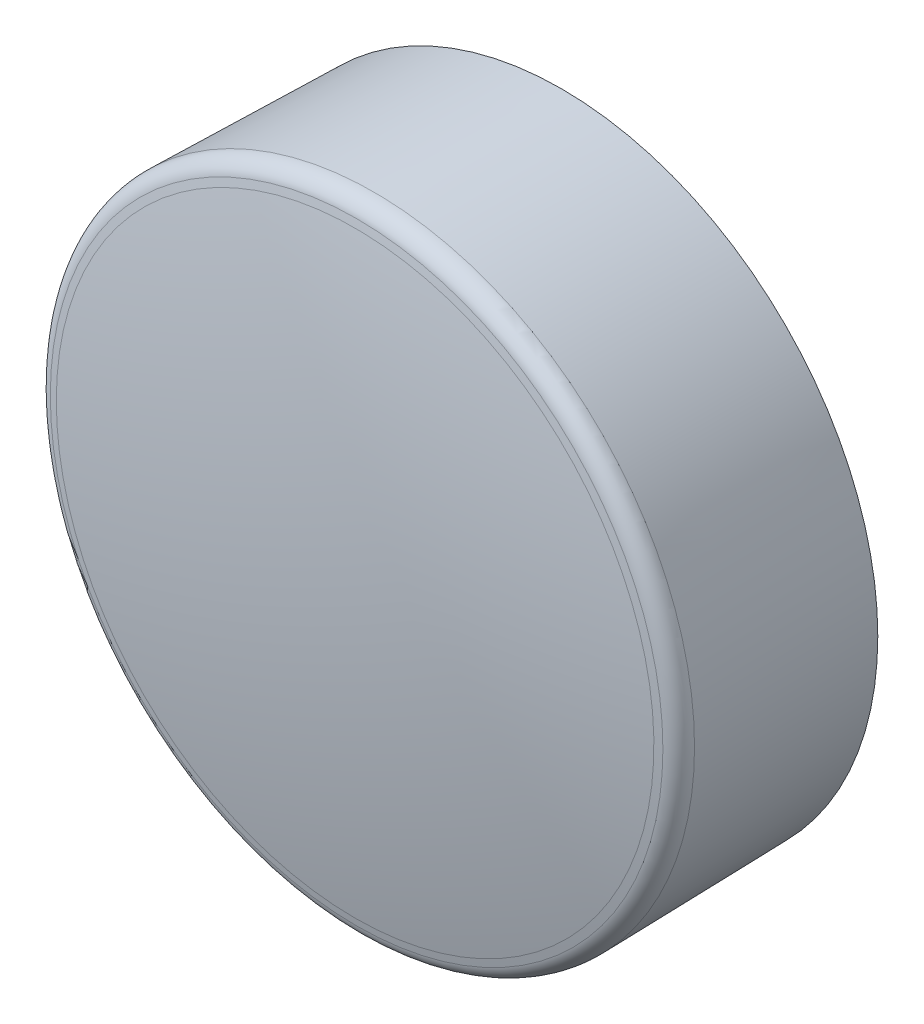
ISO-10303-21;
HEADER;
FILE_DESCRIPTION(('STEP AP214'),'2;1');
FILE_NAME('part.step','',(''),(''),'','','');
FILE_SCHEMA(('AUTOMOTIVE_DESIGN { 1 0 10303 214 1 1 1 1 }'));
ENDSEC;
DATA;
#1=APPLICATION_CONTEXT('core data for automotive mechanical design processes');
#2=APPLICATION_PROTOCOL_DEFINITION('international standard','automotive_design',2000,#1);
#3=PRODUCT_CONTEXT('',#1,'mechanical');
#4=PRODUCT('Part','Part','',(#3));
#5=PRODUCT_RELATED_PRODUCT_CATEGORY('part','',(#4));
#6=PRODUCT_DEFINITION_FORMATION('','',#4);
#7=PRODUCT_DEFINITION_CONTEXT('part definition',#1,'design');
#8=PRODUCT_DEFINITION('design','',#6,#7);
#9=PRODUCT_DEFINITION_SHAPE('','',#8);
#10=(LENGTH_UNIT() NAMED_UNIT(*) SI_UNIT(.MILLI.,.METRE.));
#11=(NAMED_UNIT(*) PLANE_ANGLE_UNIT() SI_UNIT($,.RADIAN.));
#12=(NAMED_UNIT(*) SI_UNIT($,.STERADIAN.) SOLID_ANGLE_UNIT());
#13=UNCERTAINTY_MEASURE_WITH_UNIT(LENGTH_MEASURE(1.E-05),#10,'distance_accuracy_value','');
#14=(GEOMETRIC_REPRESENTATION_CONTEXT(3) GLOBAL_UNCERTAINTY_ASSIGNED_CONTEXT((#13)) GLOBAL_UNIT_ASSIGNED_CONTEXT((#10,
#11,#12)) REPRESENTATION_CONTEXT('',''));
#15=CARTESIAN_POINT('',(0.,0.,0.));
#16=DIRECTION('',(0.,0.,1.));
#17=DIRECTION('',(1.,0.,0.));
#18=AXIS2_PLACEMENT_3D('',#15,#16,#17);
#19=CARTESIAN_POINT('',(0.,0.,6.00000008940697));
#20=DIRECTION('',(0.,0.,1.));
#21=DIRECTION('',(1.,0.,0.));
#22=AXIS2_PLACEMENT_3D('',#19,#20,#21);
#23=SPHERICAL_SURFACE('',#22,2.17741141713995);
#24=CARTESIAN_POINT('',(0.,0.,7.63632094803309));
#25=DIRECTION('',(0.,0.,-1.));
#26=DIRECTION('',(1.,0.,0.));
#27=AXIS2_PLACEMENT_3D('',#24,#25,#26);
#28=CIRCLE('',#27,1.43651471524536);
#29=CARTESIAN_POINT('',(-1.43651471524536,0.,7.63632094803309));
#30=VERTEX_POINT('',#29);
#31=CARTESIAN_POINT('',(0.,-1.43651471524536,7.63632094803309));
#32=VERTEX_POINT('',#31);
#33=EDGE_CURVE('P0_E19',#30,#32,#28,.T.);
#34=ORIENTED_EDGE('',*,*,#33,.F.);
#35=CARTESIAN_POINT('',(0.,0.,6.00000008940697));
#36=DIRECTION('',(0.,-1.,0.));
#37=DIRECTION('',(-1.,0.,0.));
#38=AXIS2_PLACEMENT_3D('',#35,#36,#37);
#39=CIRCLE('',#38,2.17741141713995);
#40=CARTESIAN_POINT('',(0.,0.,8.17741150654691));
#41=VERTEX_POINT('',#40);
#42=EDGE_CURVE('P0_E11',#41,#30,#39,.T.);
#43=ORIENTED_EDGE('',*,*,#42,.F.);
#44=ORIENTED_EDGE('',*,*,#42,.T.);
#45=CARTESIAN_POINT('',(0.,0.,7.63632094803309));
#46=DIRECTION('',(0.,0.,-1.));
#47=DIRECTION('',(1.,0.,0.));
#48=AXIS2_PLACEMENT_3D('',#45,#46,#47);
#49=CIRCLE('',#48,1.43651471524536);
#50=EDGE_CURVE('P0_E56',#32,#30,#49,.T.);
#51=ORIENTED_EDGE('',*,*,#50,.F.);
#52=EDGE_LOOP('',(#34,#43,#44,#51));
#53=FACE_BOUND('',#52,.T.);
#54=ADVANCED_FACE('P0_F16',(#53),#23,.T.);
#55=CARTESIAN_POINT('',(0.,0.,6.00000008940697));
#56=DIRECTION('',(0.,0.,-1.));
#57=DIRECTION('',(0.,-1.,0.));
#58=AXIS2_PLACEMENT_3D('',#55,#56,#57);
#59=PLANE('',#58);
#60=CARTESIAN_POINT('',(0.,0.,6.00000008940697));
#61=DIRECTION('',(0.,0.,-1.));
#62=DIRECTION('',(1.,0.,0.));
#63=AXIS2_PLACEMENT_3D('',#60,#61,#62);
#64=CIRCLE('',#63,1.43651471524536);
#65=CARTESIAN_POINT('',(0.,-1.43651471524536,6.00000008940697));
#66=VERTEX_POINT('',#65);
#67=EDGE_CURVE('P0_E53',#66,#66,#64,.T.);
#68=ORIENTED_EDGE('',*,*,#67,.T.);
#69=EDGE_LOOP('',(#68));
#70=FACE_BOUND('',#69,.T.);
#71=ADVANCED_FACE('P0_F58',(#70),#59,.T.);
#72=CARTESIAN_POINT('',(0.,0.,6.81816051872003));
#73=DIRECTION('',(0.,0.,-1.));
#74=DIRECTION('',(0.,1.,0.));
#75=AXIS2_PLACEMENT_3D('',#72,#73,#74);
#76=CYLINDRICAL_SURFACE('',#75,1.43651471524536);
#77=ORIENTED_EDGE('',*,*,#67,.F.);
#78=DIRECTION('',(0.,0.,1.));
#79=VECTOR('',#78,1.);
#80=CARTESIAN_POINT('',(0.,-1.43651471524536,6.81816051872003));
#81=LINE('',#80,#79);
#82=EDGE_CURVE('P0_E50',#66,#32,#81,.T.);
#83=ORIENTED_EDGE('',*,*,#82,.T.);
#84=ORIENTED_EDGE('',*,*,#50,.T.);
#85=ORIENTED_EDGE('',*,*,#33,.T.);
#86=ORIENTED_EDGE('',*,*,#82,.F.);
#87=EDGE_LOOP('',(#77,#83,#84,#85,#86));
#88=FACE_BOUND('',#87,.T.);
#89=ADVANCED_FACE('P0_F52',(#88),#76,.T.);
#90=CLOSED_SHELL('',(#54,#71,#89));
#91=MANIFOLD_SOLID_BREP('P0_B1',#90);
#92=CARTESIAN_POINT('',(0.,0.,8.78711953919315));
#93=DIRECTION('',(0.,0.,1.));
#94=DIRECTION('',(0.,1.,0.));
#95=AXIS2_PLACEMENT_3D('',#92,#93,#94);
#96=CONICAL_SURFACE('',#95,4.11323306509245,1.1647582702333);
#97=CARTESIAN_POINT('',(0.,0.,7.63632094803309));
#98=DIRECTION('',(0.,0.,-1.));
#99=DIRECTION('',(1.,0.,0.));
#100=AXIS2_PLACEMENT_3D('',#97,#98,#99);
#101=CIRCLE('',#100,1.43651471524536);
#102=CARTESIAN_POINT('',(0.,-1.43651471524536,7.63632094803309));
#103=VERTEX_POINT('',#102);
#104=EDGE_CURVE('P1_E25',#103,#103,#101,.T.);
#105=ORIENTED_EDGE('',*,*,#104,.T.);
#106=DIRECTION('',(0.,-0.918692888285036,0.394972628183901));
#107=VECTOR('',#106,1.);
#108=CARTESIAN_POINT('',(0.,-4.11323306509245,8.78711953919315));
#109=LINE('',#108,#107);
#110=CARTESIAN_POINT('',(0.,-6.78995141493954,9.9379181303532));
#111=VERTEX_POINT('',#110);
#112=EDGE_CURVE('P1_E11',#103,#111,#109,.T.);
#113=ORIENTED_EDGE('',*,*,#112,.T.);
#114=CARTESIAN_POINT('',(0.,0.,9.9379181303532));
#115=DIRECTION('',(0.,0.,-1.));
#116=DIRECTION('',(1.,0.,0.));
#117=AXIS2_PLACEMENT_3D('',#114,#115,#116);
#118=CIRCLE('',#117,6.78995141493954);
#119=EDGE_CURVE('P1_E52',#111,#111,#118,.T.);
#120=ORIENTED_EDGE('',*,*,#119,.F.);
#121=ORIENTED_EDGE('',*,*,#112,.F.);
#122=EDGE_LOOP('',(#105,#113,#120,#121));
#123=FACE_BOUND('',#122,.T.);
#124=ADVANCED_FACE('P1_F16',(#123),#96,.F.);
#125=CARTESIAN_POINT('',(0.,0.,6.81816051872003));
#126=DIRECTION('',(0.,0.,-1.));
#127=DIRECTION('',(0.,1.,0.));
#128=AXIS2_PLACEMENT_3D('',#125,#126,#127);
#129=CYLINDRICAL_SURFACE('',#128,1.43651471524536);
#130=CARTESIAN_POINT('',(0.,0.,6.00000008940697));
#131=DIRECTION('',(0.,0.,-1.));
#132=DIRECTION('',(1.,0.,0.));
#133=AXIS2_PLACEMENT_3D('',#130,#131,#132);
#134=CIRCLE('',#133,1.43651471524536);
#135=CARTESIAN_POINT('',(0.,-1.43651471524536,6.00000008940697));
#136=VERTEX_POINT('',#135);
#137=EDGE_CURVE('P1_E65',#136,#136,#134,.T.);
#138=ORIENTED_EDGE('',*,*,#137,.T.);
#139=DIRECTION('',(0.,0.,1.));
#140=VECTOR('',#139,1.);
#141=CARTESIAN_POINT('',(0.,-1.43651471524536,6.81816051872003));
#142=LINE('',#141,#140);
#143=EDGE_CURVE('P1_E69',#136,#103,#142,.T.);
#144=ORIENTED_EDGE('',*,*,#143,.T.);
#145=ORIENTED_EDGE('',*,*,#104,.F.);
#146=ORIENTED_EDGE('',*,*,#143,.F.);
#147=EDGE_LOOP('',(#138,#144,#145,#146));
#148=FACE_BOUND('',#147,.T.);
#149=ADVANCED_FACE('P1_F77',(#148),#129,.F.);
#150=CARTESIAN_POINT('',(0.,1.43651471524536,6.00000008940697));
#151=DIRECTION('',(0.,0.,-1.));
#152=DIRECTION('',(0.,-1.,0.));
#153=AXIS2_PLACEMENT_3D('',#150,#151,#152);
#154=PLANE('',#153);
#155=ORIENTED_EDGE('',*,*,#137,.F.);
#156=EDGE_LOOP('',(#155));
#157=FACE_BOUND('',#156,.T.);
#158=CARTESIAN_POINT('',(0.,0.,6.00000008940697));
#159=DIRECTION('',(0.,0.,-1.));
#160=DIRECTION('',(1.,0.,0.));
#161=AXIS2_PLACEMENT_3D('',#158,#159,#160);
#162=CIRCLE('',#161,6.70145887518744);
#163=CARTESIAN_POINT('',(0.,-6.70145887518743,6.00000008940697));
#164=VERTEX_POINT('',#163);
#165=EDGE_CURVE('P1_E51',#164,#164,#162,.T.);
#166=ORIENTED_EDGE('',*,*,#165,.T.);
#167=EDGE_LOOP('',(#166));
#168=FACE_BOUND('',#167,.T.);
#169=ADVANCED_FACE('P1_F56',(#157,#168),#154,.T.);
#170=CARTESIAN_POINT('',(0.,0.,7.96895910988009));
#171=DIRECTION('',(0.,0.,1.));
#172=DIRECTION('',(0.,1.,0.));
#173=AXIS2_PLACEMENT_3D('',#170,#171,#172);
#174=CONICAL_SURFACE('',#173,6.74570514506349,0.0224681284604717);
#175=ORIENTED_EDGE('',*,*,#165,.F.);
#176=DIRECTION('',(0.,-0.0224662381267485,0.999747602219896));
#177=VECTOR('',#176,1.);
#178=CARTESIAN_POINT('',(0.,-6.74570514506349,7.96895910988009));
#179=LINE('',#178,#177);
#180=EDGE_CURVE('P1_E48',#164,#111,#179,.T.);
#181=ORIENTED_EDGE('',*,*,#180,.T.);
#182=ORIENTED_EDGE('',*,*,#119,.T.);
#183=ORIENTED_EDGE('',*,*,#180,.F.);
#184=EDGE_LOOP('',(#175,#181,#182,#183));
#185=FACE_BOUND('',#184,.T.);
#186=ADVANCED_FACE('P1_F50',(#185),#174,.T.);
#187=CLOSED_SHELL('',(#124,#149,#169,#186));
#188=MANIFOLD_SOLID_BREP('P1_B1',#187);
#189=CARTESIAN_POINT('',(0.,0.,8.13543669475693));
#190=DIRECTION('',(0.,0.,1.));
#191=DIRECTION('',(0.,1.,0.));
#192=AXIS2_PLACEMENT_3D('',#189,#190,#191);
#193=CONICAL_SURFACE('',#192,7.24957244511609,0.0224681284604766);
#194=CARTESIAN_POINT('',(0.,0.,6.00000008940697));
#195=DIRECTION('',(0.,0.,-1.));
#196=DIRECTION('',(1.,0.,0.));
#197=AXIS2_PLACEMENT_3D('',#194,#195,#196);
#198=CIRCLE('',#197,7.20158510593785);
#199=CARTESIAN_POINT('',(0.,-7.20158510593784,6.00000008940697));
#200=VERTEX_POINT('',#199);
#201=EDGE_CURVE('P2_E105',#200,#200,#198,.T.);
#202=ORIENTED_EDGE('',*,*,#201,.F.);
#203=DIRECTION('',(0.,-0.0224662381267515,0.999747602219896));
#204=VECTOR('',#203,1.);
#205=CARTESIAN_POINT('',(0.,-7.24957244511609,8.13543669475693));
#206=LINE('',#205,#204);
#207=CARTESIAN_POINT('',(0.,-7.29755978429435,10.2708733001069));
#208=VERTEX_POINT('',#207);
#209=EDGE_CURVE('P2_E11',#200,#208,#206,.T.);
#210=ORIENTED_EDGE('',*,*,#209,.T.);
#211=CARTESIAN_POINT('',(0.,0.,10.2708733001069));
#212=DIRECTION('',(0.,0.,-1.));
#213=DIRECTION('',(1.,0.,0.));
#214=AXIS2_PLACEMENT_3D('',#211,#212,#213);
#215=CIRCLE('',#214,7.29755978429435);
#216=CARTESIAN_POINT('',(7.29755978429435,0.,10.2708733001069));
#217=VERTEX_POINT('',#216);
#218=EDGE_CURVE('P2_E82',#208,#217,#215,.T.);
#219=ORIENTED_EDGE('',*,*,#218,.T.);
#220=CARTESIAN_POINT('',(0.,0.,10.2708733001069));
#221=DIRECTION('',(0.,0.,-1.));
#222=DIRECTION('',(1.,0.,0.));
#223=AXIS2_PLACEMENT_3D('',#220,#221,#222);
#224=CIRCLE('',#223,7.29755978429435);
#225=EDGE_CURVE('P2_E77',#217,#208,#224,.T.);
#226=ORIENTED_EDGE('',*,*,#225,.T.);
#227=ORIENTED_EDGE('',*,*,#209,.F.);
#228=EDGE_LOOP('',(#202,#210,#219,#226,#227));
#229=FACE_BOUND('',#228,.T.);
#230=ADVANCED_FACE('P2_F16',(#229),#193,.T.);
#231=CARTESIAN_POINT('',(0.,0.,10.2798597953576));
#232=DIRECTION('',(0.,0.,-1.));
#233=DIRECTION('',(-1.,0.,0.));
#234=AXIS2_PLACEMENT_3D('',#231,#232,#233);
#235=TOROIDAL_SURFACE('',#234,6.89766074340639,0.4);
#236=ORIENTED_EDGE('',*,*,#218,.F.);
#237=ORIENTED_EDGE('',*,*,#225,.F.);
#238=CARTESIAN_POINT('',(6.89766074340639,0.,10.2798597953576));
#239=DIRECTION('',(0.,-1.,0.));
#240=DIRECTION('',(1.,0.,0.));
#241=AXIS2_PLACEMENT_3D('',#238,#239,#240);
#242=CIRCLE('',#241,0.4);
#243=CARTESIAN_POINT('',(6.97760868873675,0.,10.671788776217));
#244=VERTEX_POINT('',#243);
#245=EDGE_CURVE('P2_E27',#217,#244,#242,.T.);
#246=ORIENTED_EDGE('',*,*,#245,.T.);
#247=CARTESIAN_POINT('',(0.,0.,10.671788776217));
#248=DIRECTION('',(0.,0.,-1.));
#249=DIRECTION('',(1.,0.,0.));
#250=AXIS2_PLACEMENT_3D('',#247,#248,#249);
#251=CIRCLE('',#250,6.97760868873675);
#252=CARTESIAN_POINT('',(-6.97760868873675,0.,10.671788776217));
#253=VERTEX_POINT('',#252);
#254=EDGE_CURVE('P2_E75',#244,#253,#251,.T.);
#255=ORIENTED_EDGE('',*,*,#254,.T.);
#256=CARTESIAN_POINT('',(0.,0.,10.671788776217));
#257=DIRECTION('',(0.,0.,-1.));
#258=DIRECTION('',(1.,0.,0.));
#259=AXIS2_PLACEMENT_3D('',#256,#257,#258);
#260=CIRCLE('',#259,6.97760868873675);
#261=EDGE_CURVE('P2_E71',#253,#244,#260,.T.);
#262=ORIENTED_EDGE('',*,*,#261,.T.);
#263=ORIENTED_EDGE('',*,*,#245,.F.);
#264=EDGE_LOOP('',(#236,#237,#246,#255,#262,#263));
#265=FACE_BOUND('',#264,.T.);
#266=ADVANCED_FACE('P2_F74',(#265),#235,.T.);
#267=CARTESIAN_POINT('',(0.,0.,-23.5345570017989));
#268=DIRECTION('',(0.,0.,1.));
#269=DIRECTION('',(1.,0.,0.));
#270=AXIS2_PLACEMENT_3D('',#267,#268,#269);
#271=SPHERICAL_SURFACE('',#270,34.9107592942107);
#272=CARTESIAN_POINT('',(0.,0.,10.7061052496852));
#273=DIRECTION('',(0.,0.,-1.));
#274=DIRECTION('',(1.,0.,0.));
#275=AXIS2_PLACEMENT_3D('',#272,#273,#274);
#276=CIRCLE('',#275,6.8072140467383);
#277=CARTESIAN_POINT('',(-6.8072140467383,0.,10.7061052496852));
#278=VERTEX_POINT('',#277);
#279=CARTESIAN_POINT('',(0.,-6.8072140467383,10.7061052496852));
#280=VERTEX_POINT('',#279);
#281=EDGE_CURVE('P2_E102',#278,#280,#276,.T.);
#282=ORIENTED_EDGE('',*,*,#281,.T.);
#283=CARTESIAN_POINT('',(0.,0.,10.7061052496852));
#284=DIRECTION('',(0.,0.,-1.));
#285=DIRECTION('',(1.,0.,0.));
#286=AXIS2_PLACEMENT_3D('',#283,#284,#285);
#287=CIRCLE('',#286,6.8072140467383);
#288=EDGE_CURVE('P2_E90',#280,#278,#287,.T.);
#289=ORIENTED_EDGE('',*,*,#288,.T.);
#290=CARTESIAN_POINT('',(0.,0.,-23.5345570017989));
#291=DIRECTION('',(0.,-1.,0.));
#292=DIRECTION('',(-1.,0.,0.));
#293=AXIS2_PLACEMENT_3D('',#290,#291,#292);
#294=CIRCLE('',#293,34.9107592942107);
#295=EDGE_CURVE('P2_E65',#278,#253,#294,.T.);
#296=ORIENTED_EDGE('',*,*,#295,.T.);
#297=ORIENTED_EDGE('',*,*,#254,.F.);
#298=ORIENTED_EDGE('',*,*,#261,.F.);
#299=ORIENTED_EDGE('',*,*,#295,.F.);
#300=EDGE_LOOP('',(#282,#289,#296,#297,#298,#299));
#301=FACE_BOUND('',#300,.T.);
#302=ADVANCED_FACE('P2_F18',(#301),#271,.T.);
#303=CARTESIAN_POINT('',(0.,0.,8.35305266954607));
#304=DIRECTION('',(0.,0.,1.));
#305=DIRECTION('',(0.,1.,0.));
#306=AXIS2_PLACEMENT_3D('',#303,#304,#305);
#307=CONICAL_SURFACE('',#306,6.75433646096287,0.0224681284604717);
#308=CARTESIAN_POINT('',(0.,0.,6.00000008940697));
#309=DIRECTION('',(0.,0.,-1.));
#310=DIRECTION('',(1.,0.,0.));
#311=AXIS2_PLACEMENT_3D('',#308,#309,#310);
#312=CIRCLE('',#311,6.70145887518744);
#313=CARTESIAN_POINT('',(0.,-6.70145887518744,6.00000008940697));
#314=VERTEX_POINT('',#313);
#315=EDGE_CURVE('P2_E109',#314,#314,#312,.T.);
#316=ORIENTED_EDGE('',*,*,#315,.T.);
#317=DIRECTION('',(0.,-0.0224662381267481,0.999747602219896));
#318=VECTOR('',#317,1.);
#319=CARTESIAN_POINT('',(0.,-6.75433646096287,8.35305266954607));
#320=LINE('',#319,#318);
#321=EDGE_CURVE('P2_E20',#314,#280,#320,.T.);
#322=ORIENTED_EDGE('',*,*,#321,.T.);
#323=ORIENTED_EDGE('',*,*,#281,.F.);
#324=ORIENTED_EDGE('',*,*,#288,.F.);
#325=ORIENTED_EDGE('',*,*,#321,.F.);
#326=EDGE_LOOP('',(#316,#322,#323,#324,#325));
#327=FACE_BOUND('',#326,.T.);
#328=ADVANCED_FACE('P2_F121',(#327),#307,.F.);
#329=CARTESIAN_POINT('',(0.,6.70145887518744,6.00000008940697));
#330=DIRECTION('',(0.,0.,-1.));
#331=DIRECTION('',(0.,-1.,0.));
#332=AXIS2_PLACEMENT_3D('',#329,#330,#331);
#333=PLANE('',#332);
#334=ORIENTED_EDGE('',*,*,#315,.F.);
#335=EDGE_LOOP('',(#334));
#336=FACE_BOUND('',#335,.T.);
#337=ORIENTED_EDGE('',*,*,#201,.T.);
#338=EDGE_LOOP('',(#337));
#339=FACE_BOUND('',#338,.T.);
#340=ADVANCED_FACE('P2_F147',(#336,#339),#333,.T.);
#341=CLOSED_SHELL('',(#230,#266,#302,#328,#340));
#342=MANIFOLD_SOLID_BREP('P2_B1',#341);
#343=CARTESIAN_POINT('',(0.,0.,8.90028723191313));
#344=DIRECTION('',(0.,0.,1.));
#345=DIRECTION('',(0.,1.,0.));
#346=AXIS2_PLACEMENT_3D('',#343,#344,#345);
#347=CONICAL_SURFACE('',#346,4.12327516472783,1.1647582702333);
#348=CARTESIAN_POINT('',(0.,0.,7.75274413230997));
#349=DIRECTION('',(0.,0.,-1.));
#350=DIRECTION('',(1.,0.,0.));
#351=AXIS2_PLACEMENT_3D('',#348,#349,#350);
#352=CIRCLE('',#351,1.45412897742512);
#353=CARTESIAN_POINT('',(-1.45412897742512,0.,7.75274413230997));
#354=VERTEX_POINT('',#353);
#355=CARTESIAN_POINT('',(0.,-1.45412897742512,7.75274413230997));
#356=VERTEX_POINT('',#355);
#357=EDGE_CURVE('P3_E20',#354,#356,#352,.T.);
#358=ORIENTED_EDGE('',*,*,#357,.F.);
#359=CARTESIAN_POINT('',(0.,0.,7.75274413230997));
#360=DIRECTION('',(0.,0.,-1.));
#361=DIRECTION('',(1.,0.,0.));
#362=AXIS2_PLACEMENT_3D('',#359,#360,#361);
#363=CIRCLE('',#362,1.45412897742512);
#364=EDGE_CURVE('P3_E66',#356,#354,#363,.T.);
#365=ORIENTED_EDGE('',*,*,#364,.F.);
#366=DIRECTION('',(0.,-0.918692888285036,0.394972628183901));
#367=VECTOR('',#366,1.);
#368=CARTESIAN_POINT('',(0.,-4.12327516472783,8.90028723191313));
#369=LINE('',#368,#367);
#370=CARTESIAN_POINT('',(0.,-6.79242135203055,10.0478303315163));
#371=VERTEX_POINT('',#370);
#372=EDGE_CURVE('P3_E11',#356,#371,#369,.T.);
#373=ORIENTED_EDGE('',*,*,#372,.T.);
#374=CARTESIAN_POINT('',(0.,0.,10.0478303315163));
#375=DIRECTION('',(0.,0.,-1.));
#376=DIRECTION('',(1.,0.,0.));
#377=AXIS2_PLACEMENT_3D('',#374,#375,#376);
#378=CIRCLE('',#377,6.79242135203055);
#379=EDGE_CURVE('P3_E104',#371,#371,#378,.T.);
#380=ORIENTED_EDGE('',*,*,#379,.T.);
#381=ORIENTED_EDGE('',*,*,#372,.F.);
#382=EDGE_LOOP('',(#358,#365,#373,#380,#381));
#383=FACE_BOUND('',#382,.T.);
#384=ADVANCED_FACE('P3_F16',(#383),#347,.T.);
#385=CARTESIAN_POINT('',(0.,0.,10.3769677906007));
#386=DIRECTION('',(0.,0.,1.));
#387=DIRECTION('',(0.,1.,0.));
#388=AXIS2_PLACEMENT_3D('',#385,#386,#387);
#389=CONICAL_SURFACE('',#388,6.79981769938442,0.0224681284604717);
#390=ORIENTED_EDGE('',*,*,#379,.F.);
#391=DIRECTION('',(0.,-0.0224662381267481,0.999747602219896));
#392=VECTOR('',#391,1.);
#393=CARTESIAN_POINT('',(0.,-6.79981769938442,10.3769677906007));
#394=LINE('',#393,#392);
#395=CARTESIAN_POINT('',(0.,-6.8072140467383,10.7061052496852));
#396=VERTEX_POINT('',#395);
#397=EDGE_CURVE('P3_E27',#371,#396,#394,.T.);
#398=ORIENTED_EDGE('',*,*,#397,.T.);
#399=CARTESIAN_POINT('',(0.,0.,10.7061052496852));
#400=DIRECTION('',(0.,0.,-1.));
#401=DIRECTION('',(1.,0.,0.));
#402=AXIS2_PLACEMENT_3D('',#399,#400,#401);
#403=CIRCLE('',#402,6.8072140467383);
#404=CARTESIAN_POINT('',(-6.8072140467383,0.,10.7061052496852));
#405=VERTEX_POINT('',#404);
#406=EDGE_CURVE('P3_E98',#396,#405,#403,.T.);
#407=ORIENTED_EDGE('',*,*,#406,.T.);
#408=CARTESIAN_POINT('',(0.,0.,10.7061052496852));
#409=DIRECTION('',(0.,0.,-1.));
#410=DIRECTION('',(1.,0.,0.));
#411=AXIS2_PLACEMENT_3D('',#408,#409,#410);
#412=CIRCLE('',#411,6.8072140467383);
#413=EDGE_CURVE('P3_E65',#405,#396,#412,.T.);
#414=ORIENTED_EDGE('',*,*,#413,.T.);
#415=ORIENTED_EDGE('',*,*,#397,.F.);
#416=EDGE_LOOP('',(#390,#398,#407,#414,#415));
#417=FACE_BOUND('',#416,.T.);
#418=ADVANCED_FACE('P3_F133',(#417),#389,.T.);
#419=CARTESIAN_POINT('',(0.,0.,-23.5345570017989));
#420=DIRECTION('',(0.,0.,1.));
#421=DIRECTION('',(1.,0.,0.));
#422=AXIS2_PLACEMENT_3D('',#419,#420,#421);
#423=SPHERICAL_SURFACE('',#422,34.9107592942107);
#424=ORIENTED_EDGE('',*,*,#413,.F.);
#425=CARTESIAN_POINT('',(0.,0.,-23.5345570017989));
#426=DIRECTION('',(0.,-1.,0.));
#427=DIRECTION('',(-1.,0.,0.));
#428=AXIS2_PLACEMENT_3D('',#425,#426,#427);
#429=CIRCLE('',#428,34.9107592942107);
#430=CARTESIAN_POINT('',(0.,0.,11.3762022924118));
#431=VERTEX_POINT('',#430);
#432=EDGE_CURVE('P3_E91',#431,#405,#429,.T.);
#433=ORIENTED_EDGE('',*,*,#432,.F.);
#434=ORIENTED_EDGE('',*,*,#432,.T.);
#435=ORIENTED_EDGE('',*,*,#406,.F.);
#436=EDGE_LOOP('',(#424,#433,#434,#435));
#437=FACE_BOUND('',#436,.T.);
#438=ADVANCED_FACE('P3_F18',(#437),#423,.T.);
#439=CARTESIAN_POINT('',(0.,0.,6.00000008940697));
#440=DIRECTION('',(0.,0.,1.));
#441=DIRECTION('',(1.,0.,0.));
#442=AXIS2_PLACEMENT_3D('',#439,#440,#441);
#443=SPHERICAL_SURFACE('',#442,2.27741141713995);
#444=ORIENTED_EDGE('',*,*,#357,.T.);
#445=ORIENTED_EDGE('',*,*,#364,.T.);
#446=CARTESIAN_POINT('',(0.,0.,6.00000008940697));
#447=DIRECTION('',(0.,-1.,0.));
#448=DIRECTION('',(-1.,0.,0.));
#449=AXIS2_PLACEMENT_3D('',#446,#447,#448);
#450=CIRCLE('',#449,2.27741141713995);
#451=CARTESIAN_POINT('',(0.,0.,8.27741150654691));
#452=VERTEX_POINT('',#451);
#453=EDGE_CURVE('P3_E61',#452,#354,#450,.T.);
#454=ORIENTED_EDGE('',*,*,#453,.F.);
#455=ORIENTED_EDGE('',*,*,#453,.T.);
#456=EDGE_LOOP('',(#444,#445,#454,#455));
#457=FACE_BOUND('',#456,.T.);
#458=ADVANCED_FACE('P3_F63',(#457),#443,.F.);
#459=CLOSED_SHELL('',(#384,#418,#438,#458));
#460=MANIFOLD_SOLID_BREP('P3_B1',#459);
#461=ADVANCED_BREP_SHAPE_REPRESENTATION('',(#18,#91,#188,#342,#460),#14);
#462=SHAPE_DEFINITION_REPRESENTATION(#9,#461);
ENDSEC;
END-ISO-10303-21;
